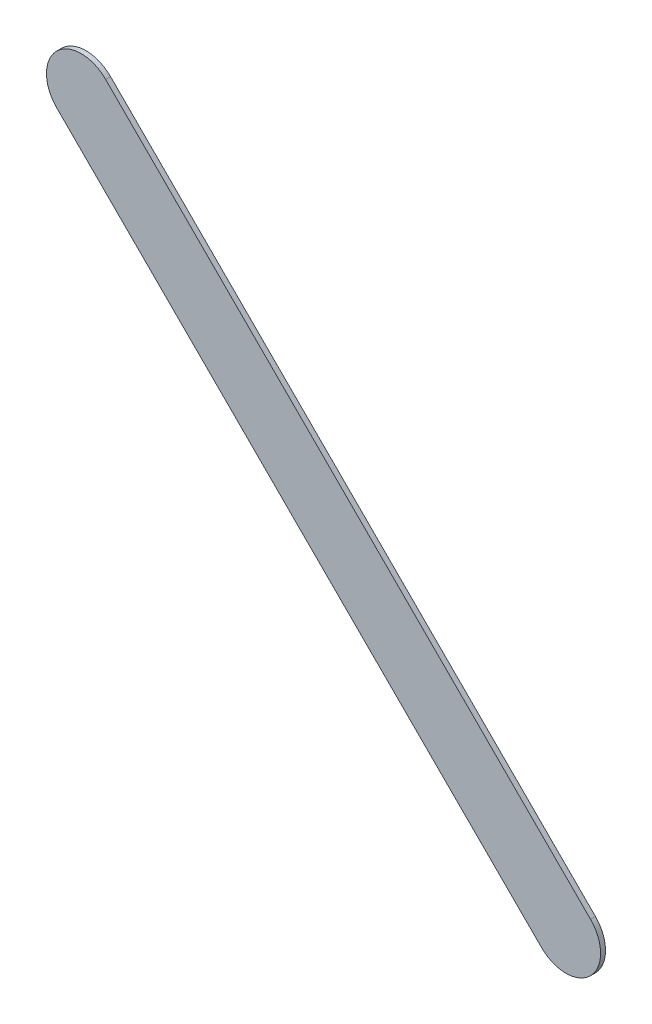
ISO-10303-21;
HEADER;
FILE_DESCRIPTION(('STEP AP214'),'2;1');
FILE_NAME('part.step','',(''),(''),'','','');
FILE_SCHEMA(('AUTOMOTIVE_DESIGN { 1 0 10303 214 1 1 1 1 }'));
ENDSEC;
DATA;
#1=APPLICATION_CONTEXT('core data for automotive mechanical design processes');
#2=APPLICATION_PROTOCOL_DEFINITION('international standard','automotive_design',2000,#1);
#3=PRODUCT_CONTEXT('',#1,'mechanical');
#4=PRODUCT('Part','Part','',(#3));
#5=PRODUCT_RELATED_PRODUCT_CATEGORY('part','',(#4));
#6=PRODUCT_DEFINITION_FORMATION('','',#4);
#7=PRODUCT_DEFINITION_CONTEXT('part definition',#1,'design');
#8=PRODUCT_DEFINITION('design','',#6,#7);
#9=PRODUCT_DEFINITION_SHAPE('','',#8);
#10=(LENGTH_UNIT() NAMED_UNIT(*) SI_UNIT(.MILLI.,.METRE.));
#11=(NAMED_UNIT(*) PLANE_ANGLE_UNIT() SI_UNIT($,.RADIAN.));
#12=(NAMED_UNIT(*) SI_UNIT($,.STERADIAN.) SOLID_ANGLE_UNIT());
#13=UNCERTAINTY_MEASURE_WITH_UNIT(LENGTH_MEASURE(1.E-05),#10,'distance_accuracy_value','');
#14=(GEOMETRIC_REPRESENTATION_CONTEXT(3) GLOBAL_UNCERTAINTY_ASSIGNED_CONTEXT((#13)) GLOBAL_UNIT_ASSIGNED_CONTEXT((#10,
#11,#12)) REPRESENTATION_CONTEXT('',''));
#15=CARTESIAN_POINT('',(0.,0.,0.));
#16=DIRECTION('',(0.,0.,1.));
#17=DIRECTION('',(1.,0.,0.));
#18=AXIS2_PLACEMENT_3D('',#15,#16,#17);
#19=CARTESIAN_POINT('',(33.7232244,83.82322326,0.));
#20=DIRECTION('',(0.707106781186547,0.707106781186548,0.));
#21=DIRECTION('',(0.707106781186548,-0.707106781186547,0.));
#22=AXIS2_PLACEMENT_3D('',#19,#20,#21);
#23=PLANE('',#22);
#24=DIRECTION('',(0.707106781186548,-0.707106781186547,0.));
#25=VECTOR('',#24,1.);
#26=CARTESIAN_POINT('',(33.7232244,83.82322326,0.03556));
#27=LINE('',#26,#25);
#28=CARTESIAN_POINT('',(33.7232244,83.82322326,0.03556));
#29=VERTEX_POINT('',#28);
#30=CARTESIAN_POINT('',(37.22322502,80.32322264,0.03556));
#31=VERTEX_POINT('',#30);
#32=EDGE_CURVE('E11',#29,#31,#27,.T.);
#33=ORIENTED_EDGE('',*,*,#32,.F.);
#34=DIRECTION('',(0.,0.,1.));
#35=VECTOR('',#34,1.);
#36=CARTESIAN_POINT('',(33.7232244,83.82322326,0.));
#37=LINE('',#36,#35);
#38=CARTESIAN_POINT('',(33.7232244,83.82322326,0.));
#39=VERTEX_POINT('',#38);
#40=EDGE_CURVE('E24',#39,#29,#37,.T.);
#41=ORIENTED_EDGE('',*,*,#40,.F.);
#42=DIRECTION('',(0.707106781186548,-0.707106781186547,0.));
#43=VECTOR('',#42,1.);
#44=CARTESIAN_POINT('',(33.7232244,83.82322326,0.));
#45=LINE('',#44,#43);
#46=CARTESIAN_POINT('',(37.22322502,80.32322264,0.));
#47=VERTEX_POINT('',#46);
#48=EDGE_CURVE('E75',#39,#47,#45,.T.);
#49=ORIENTED_EDGE('',*,*,#48,.T.);
#50=DIRECTION('',(0.,0.,1.));
#51=VECTOR('',#50,1.);
#52=CARTESIAN_POINT('',(37.22322502,80.32322264,0.));
#53=LINE('',#52,#51);
#54=EDGE_CURVE('E37',#47,#31,#53,.T.);
#55=ORIENTED_EDGE('',*,*,#54,.T.);
#56=EDGE_LOOP('',(#33,#41,#49,#55));
#57=FACE_BOUND('',#56,.T.);
#58=ADVANCED_FACE('F17',(#57),#23,.F.);
#59=CARTESIAN_POINT('',(37.4000014,80.49999902,0.));
#60=DIRECTION('',(0.,0.,-1.));
#61=DIRECTION('',(-0.707106781186562,-0.707106781186533,0.));
#62=AXIS2_PLACEMENT_3D('',#59,#60,#61);
#63=CYLINDRICAL_SURFACE('',#62,0.249999554103218);
#64=CARTESIAN_POINT('',(37.4000014,80.49999902,0.03556));
#65=DIRECTION('',(0.,0.,1.));
#66=DIRECTION('',(-0.707106781186562,-0.707106781186533,0.));
#67=AXIS2_PLACEMENT_3D('',#64,#65,#66);
#68=CIRCLE('',#67,0.249999554103218);
#69=CARTESIAN_POINT('',(37.57677778,80.6767754,0.03556));
#70=VERTEX_POINT('',#69);
#71=EDGE_CURVE('E83',#31,#70,#68,.T.);
#72=ORIENTED_EDGE('',*,*,#71,.F.);
#73=ORIENTED_EDGE('',*,*,#54,.F.);
#74=CARTESIAN_POINT('',(37.4000014,80.49999902,0.));
#75=DIRECTION('',(0.,0.,1.));
#76=DIRECTION('',(-0.707106781186562,-0.707106781186533,0.));
#77=AXIS2_PLACEMENT_3D('',#74,#75,#76);
#78=CIRCLE('',#77,0.249999554103218);
#79=CARTESIAN_POINT('',(37.57677778,80.6767754,0.));
#80=VERTEX_POINT('',#79);
#81=EDGE_CURVE('E81',#47,#80,#78,.T.);
#82=ORIENTED_EDGE('',*,*,#81,.T.);
#83=DIRECTION('',(0.,0.,1.));
#84=VECTOR('',#83,1.);
#85=CARTESIAN_POINT('',(37.57677778,80.6767754,0.));
#86=LINE('',#85,#84);
#87=EDGE_CURVE('E67',#80,#70,#86,.T.);
#88=ORIENTED_EDGE('',*,*,#87,.T.);
#89=EDGE_LOOP('',(#72,#73,#82,#88));
#90=FACE_BOUND('',#89,.T.);
#91=ADVANCED_FACE('F89',(#90),#63,.T.);
#92=CARTESIAN_POINT('',(37.57677778,80.6767754,0.));
#93=DIRECTION('',(-0.707106781186548,-0.707106781186547,0.));
#94=DIRECTION('',(-0.707106781186547,0.707106781186548,0.));
#95=AXIS2_PLACEMENT_3D('',#92,#93,#94);
#96=PLANE('',#95);
#97=DIRECTION('',(-0.707106781186547,0.707106781186548,0.));
#98=VECTOR('',#97,1.);
#99=CARTESIAN_POINT('',(37.57677778,80.6767754,0.03556));
#100=LINE('',#99,#98);
#101=CARTESIAN_POINT('',(34.07677716,84.17677602,0.03556));
#102=VERTEX_POINT('',#101);
#103=EDGE_CURVE('E71',#70,#102,#100,.T.);
#104=ORIENTED_EDGE('',*,*,#103,.F.);
#105=ORIENTED_EDGE('',*,*,#87,.F.);
#106=DIRECTION('',(-0.707106781186547,0.707106781186548,0.));
#107=VECTOR('',#106,1.);
#108=CARTESIAN_POINT('',(37.57677778,80.6767754,0.));
#109=LINE('',#108,#107);
#110=CARTESIAN_POINT('',(34.07677716,84.17677602,0.));
#111=VERTEX_POINT('',#110);
#112=EDGE_CURVE('E63',#80,#111,#109,.T.);
#113=ORIENTED_EDGE('',*,*,#112,.T.);
#114=DIRECTION('',(0.,0.,1.));
#115=VECTOR('',#114,1.);
#116=CARTESIAN_POINT('',(34.07677716,84.17677602,0.));
#117=LINE('',#116,#115);
#118=EDGE_CURVE('E53',#111,#102,#117,.T.);
#119=ORIENTED_EDGE('',*,*,#118,.T.);
#120=EDGE_LOOP('',(#104,#105,#113,#119));
#121=FACE_BOUND('',#120,.T.);
#122=ADVANCED_FACE('F66',(#121),#96,.F.);
#123=CARTESIAN_POINT('',(33.90000078,83.99999964,0.));
#124=DIRECTION('',(0.,0.,-1.));
#125=DIRECTION('',(0.707106781186533,0.707106781186562,0.));
#126=AXIS2_PLACEMENT_3D('',#123,#124,#125);
#127=CYLINDRICAL_SURFACE('',#126,0.249999554103225);
#128=CARTESIAN_POINT('',(33.90000078,83.99999964,0.03556));
#129=DIRECTION('',(0.,0.,1.));
#130=DIRECTION('',(0.707106781186533,0.707106781186562,0.));
#131=AXIS2_PLACEMENT_3D('',#128,#129,#130);
#132=CIRCLE('',#131,0.249999554103225);
#133=EDGE_CURVE('E59',#102,#29,#132,.T.);
#134=ORIENTED_EDGE('',*,*,#133,.F.);
#135=ORIENTED_EDGE('',*,*,#118,.F.);
#136=CARTESIAN_POINT('',(33.90000078,83.99999964,0.));
#137=DIRECTION('',(0.,0.,1.));
#138=DIRECTION('',(0.707106781186533,0.707106781186562,0.));
#139=AXIS2_PLACEMENT_3D('',#136,#137,#138);
#140=CIRCLE('',#139,0.249999554103225);
#141=EDGE_CURVE('E57',#111,#39,#140,.T.);
#142=ORIENTED_EDGE('',*,*,#141,.T.);
#143=ORIENTED_EDGE('',*,*,#40,.T.);
#144=EDGE_LOOP('',(#134,#135,#142,#143));
#145=FACE_BOUND('',#144,.T.);
#146=ADVANCED_FACE('F55',(#145),#127,.T.);
#147=CARTESIAN_POINT('',(33.7232244,83.82322326,0.));
#148=DIRECTION('',(0.,0.,-1.));
#149=DIRECTION('',(-1.,0.,0.));
#150=AXIS2_PLACEMENT_3D('',#147,#148,#149);
#151=PLANE('',#150);
#152=ORIENTED_EDGE('',*,*,#141,.F.);
#153=ORIENTED_EDGE('',*,*,#112,.F.);
#154=ORIENTED_EDGE('',*,*,#81,.F.);
#155=ORIENTED_EDGE('',*,*,#48,.F.);
#156=EDGE_LOOP('',(#152,#153,#154,#155));
#157=FACE_BOUND('',#156,.T.);
#158=ADVANCED_FACE('F74',(#157),#151,.T.);
#159=CARTESIAN_POINT('',(33.7232244,83.82322326,0.03556));
#160=DIRECTION('',(0.,0.,-1.));
#161=DIRECTION('',(-1.,0.,0.));
#162=AXIS2_PLACEMENT_3D('',#159,#160,#161);
#163=PLANE('',#162);
#164=ORIENTED_EDGE('',*,*,#32,.T.);
#165=ORIENTED_EDGE('',*,*,#71,.T.);
#166=ORIENTED_EDGE('',*,*,#103,.T.);
#167=ORIENTED_EDGE('',*,*,#133,.T.);
#168=EDGE_LOOP('',(#164,#165,#166,#167));
#169=FACE_BOUND('',#168,.T.);
#170=ADVANCED_FACE('F91',(#169),#163,.F.);
#171=CLOSED_SHELL('',(#58,#91,#122,#146,#158,#170));
#172=MANIFOLD_SOLID_BREP('B1',#171);
#173=ADVANCED_BREP_SHAPE_REPRESENTATION('',(#18,#172),#14);
#174=SHAPE_DEFINITION_REPRESENTATION(#9,#173);
ENDSEC;
END-ISO-10303-21;
